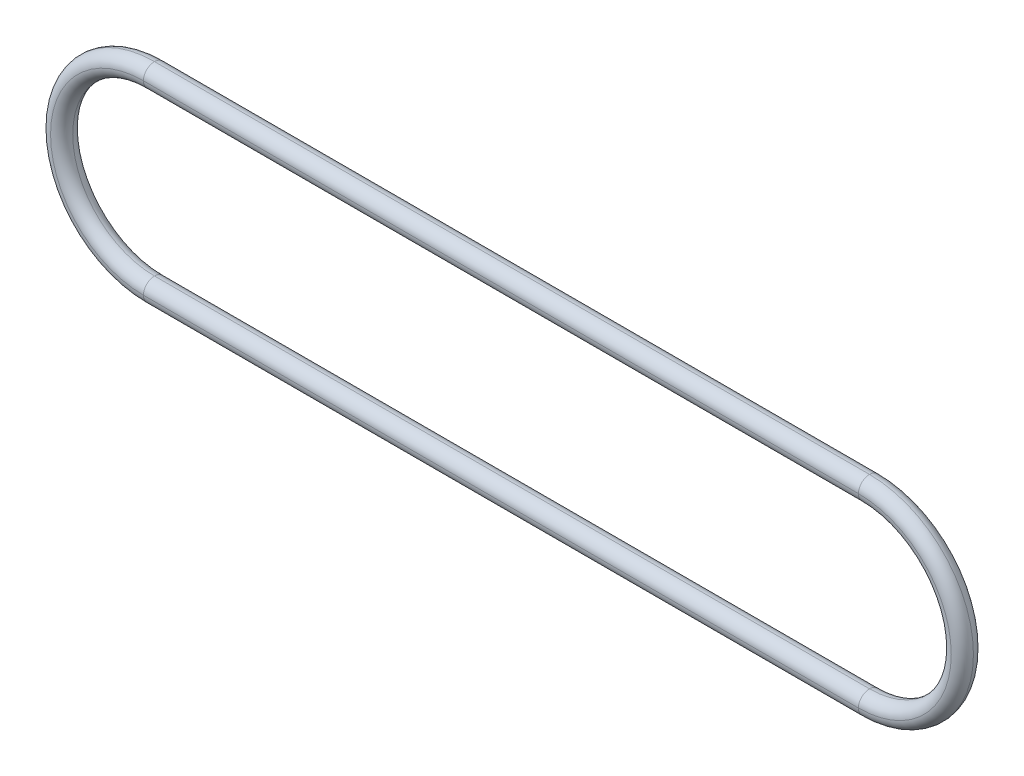
ISO-10303-21;
HEADER;
FILE_DESCRIPTION(('STEP AP214'),'2;1');
FILE_NAME('part.step','',(''),(''),'','','');
FILE_SCHEMA(('AUTOMOTIVE_DESIGN { 1 0 10303 214 1 1 1 1 }'));
ENDSEC;
DATA;
#1=APPLICATION_CONTEXT('core data for automotive mechanical design processes');
#2=APPLICATION_PROTOCOL_DEFINITION('international standard','automotive_design',2000,#1);
#3=PRODUCT_CONTEXT('',#1,'mechanical');
#4=PRODUCT('Part','Part','',(#3));
#5=PRODUCT_RELATED_PRODUCT_CATEGORY('part','',(#4));
#6=PRODUCT_DEFINITION_FORMATION('','',#4);
#7=PRODUCT_DEFINITION_CONTEXT('part definition',#1,'design');
#8=PRODUCT_DEFINITION('design','',#6,#7);
#9=PRODUCT_DEFINITION_SHAPE('','',#8);
#10=(LENGTH_UNIT() NAMED_UNIT(*) SI_UNIT(.MILLI.,.METRE.));
#11=(NAMED_UNIT(*) PLANE_ANGLE_UNIT() SI_UNIT($,.RADIAN.));
#12=(NAMED_UNIT(*) SI_UNIT($,.STERADIAN.) SOLID_ANGLE_UNIT());
#13=UNCERTAINTY_MEASURE_WITH_UNIT(LENGTH_MEASURE(1.E-05),#10,'distance_accuracy_value','');
#14=(GEOMETRIC_REPRESENTATION_CONTEXT(3) GLOBAL_UNCERTAINTY_ASSIGNED_CONTEXT((#13)) GLOBAL_UNIT_ASSIGNED_CONTEXT((#10,
#11,#12)) REPRESENTATION_CONTEXT('',''));
#15=CARTESIAN_POINT('',(0.,0.,0.));
#16=DIRECTION('',(0.,0.,1.));
#17=DIRECTION('',(1.,0.,0.));
#18=AXIS2_PLACEMENT_3D('',#15,#16,#17);
#19=CARTESIAN_POINT('',(0.,0.,2.));
#20=DIRECTION('',(0.,0.,1.));
#21=DIRECTION('',(1.,0.,0.));
#22=AXIS2_PLACEMENT_3D('',#19,#20,#21);
#23=TOROIDAL_SURFACE('',#22,16.75,2.);
#24=CARTESIAN_POINT('',(0.,-16.75,2.));
#25=DIRECTION('',(1.,0.,0.));
#26=DIRECTION('',(0.,0.,-1.));
#27=AXIS2_PLACEMENT_3D('',#24,#25,#26);
#28=CIRCLE('',#27,2.);
#29=CARTESIAN_POINT('',(0.,-16.75,4.));
#30=VERTEX_POINT('',#29);
#31=CARTESIAN_POINT('',(0.,-18.75,2.));
#32=VERTEX_POINT('',#31);
#33=EDGE_CURVE('E11',#30,#32,#28,.T.);
#34=ORIENTED_EDGE('',*,*,#33,.F.);
#35=CARTESIAN_POINT('',(0.,0.,4.));
#36=DIRECTION('',(0.,0.,1.));
#37=DIRECTION('',(1.,0.,0.));
#38=AXIS2_PLACEMENT_3D('',#35,#36,#37);
#39=CIRCLE('',#38,16.75);
#40=CARTESIAN_POINT('',(0.,16.75,4.));
#41=VERTEX_POINT('',#40);
#42=EDGE_CURVE('E190',#41,#30,#39,.T.);
#43=ORIENTED_EDGE('',*,*,#42,.F.);
#44=CARTESIAN_POINT('',(0.,16.75,2.));
#45=DIRECTION('',(1.,0.,0.));
#46=DIRECTION('',(0.,0.,-1.));
#47=AXIS2_PLACEMENT_3D('',#44,#45,#46);
#48=CIRCLE('',#47,2.);
#49=CARTESIAN_POINT('',(0.,18.75,2.));
#50=VERTEX_POINT('',#49);
#51=EDGE_CURVE('E187',#50,#41,#48,.T.);
#52=ORIENTED_EDGE('',*,*,#51,.F.);
#53=CARTESIAN_POINT('',(0.,0.,2.));
#54=DIRECTION('',(0.,0.,1.));
#55=DIRECTION('',(1.,0.,0.));
#56=AXIS2_PLACEMENT_3D('',#53,#54,#55);
#57=CIRCLE('',#56,18.75);
#58=EDGE_CURVE('E39',#32,#50,#57,.F.);
#59=ORIENTED_EDGE('',*,*,#58,.F.);
#60=EDGE_LOOP('',(#34,#43,#52,#59));
#61=FACE_BOUND('',#60,.T.);
#62=ADVANCED_FACE('F32',(#61),#23,.T.);
#63=CARTESIAN_POINT('',(0.,-16.75,2.));
#64=DIRECTION('',(-1.,0.,0.));
#65=DIRECTION('',(0.,0.,1.));
#66=AXIS2_PLACEMENT_3D('',#63,#64,#65);
#67=CYLINDRICAL_SURFACE('',#66,2.);
#68=DIRECTION('',(1.,0.,0.));
#69=VECTOR('',#68,1.);
#70=CARTESIAN_POINT('',(129.,-16.75,4.));
#71=LINE('',#70,#69);
#72=CARTESIAN_POINT('',(129.,-16.75,4.));
#73=VERTEX_POINT('',#72);
#74=EDGE_CURVE('E185',#30,#73,#71,.T.);
#75=ORIENTED_EDGE('',*,*,#74,.F.);
#76=ORIENTED_EDGE('',*,*,#33,.T.);
#77=DIRECTION('',(1.,0.,0.));
#78=VECTOR('',#77,1.);
#79=CARTESIAN_POINT('',(0.,-18.75,2.));
#80=LINE('',#79,#78);
#81=CARTESIAN_POINT('',(129.,-18.75,2.));
#82=VERTEX_POINT('',#81);
#83=EDGE_CURVE('E177',#82,#32,#80,.F.);
#84=ORIENTED_EDGE('',*,*,#83,.F.);
#85=CARTESIAN_POINT('',(129.,-16.75,2.));
#86=DIRECTION('',(1.,0.,0.));
#87=DIRECTION('',(0.,0.,-1.));
#88=AXIS2_PLACEMENT_3D('',#85,#86,#87);
#89=CIRCLE('',#88,2.);
#90=EDGE_CURVE('E174',#73,#82,#89,.T.);
#91=ORIENTED_EDGE('',*,*,#90,.F.);
#92=EDGE_LOOP('',(#75,#76,#84,#91));
#93=FACE_BOUND('',#92,.T.);
#94=ADVANCED_FACE('F222',(#93),#67,.T.);
#95=CARTESIAN_POINT('',(0.,0.,2.));
#96=DIRECTION('',(0.,0.,1.));
#97=DIRECTION('',(1.,0.,0.));
#98=AXIS2_PLACEMENT_3D('',#95,#96,#97);
#99=TOROIDAL_SURFACE('',#98,16.75,2.);
#100=CARTESIAN_POINT('',(0.,-16.75,2.));
#101=DIRECTION('',(1.,0.,0.));
#102=DIRECTION('',(0.,0.,-1.));
#103=AXIS2_PLACEMENT_3D('',#100,#101,#102);
#104=CIRCLE('',#103,2.);
#105=CARTESIAN_POINT('',(0.,-16.75,0.));
#106=VERTEX_POINT('',#105);
#107=EDGE_CURVE('E180',#32,#106,#104,.T.);
#108=ORIENTED_EDGE('',*,*,#107,.F.);
#109=ORIENTED_EDGE('',*,*,#58,.T.);
#110=CARTESIAN_POINT('',(0.,16.75,2.));
#111=DIRECTION('',(1.,0.,0.));
#112=DIRECTION('',(0.,0.,-1.));
#113=AXIS2_PLACEMENT_3D('',#110,#111,#112);
#114=CIRCLE('',#113,2.);
#115=CARTESIAN_POINT('',(0.,16.75,0.));
#116=VERTEX_POINT('',#115);
#117=EDGE_CURVE('E169',#116,#50,#114,.T.);
#118=ORIENTED_EDGE('',*,*,#117,.F.);
#119=CARTESIAN_POINT('',(0.,0.,0.));
#120=DIRECTION('',(0.,0.,1.));
#121=DIRECTION('',(1.,0.,0.));
#122=AXIS2_PLACEMENT_3D('',#119,#120,#121);
#123=CIRCLE('',#122,16.75);
#124=EDGE_CURVE('E166',#106,#116,#123,.F.);
#125=ORIENTED_EDGE('',*,*,#124,.F.);
#126=EDGE_LOOP('',(#108,#109,#118,#125));
#127=FACE_BOUND('',#126,.T.);
#128=ADVANCED_FACE('F194',(#127),#99,.T.);
#129=CARTESIAN_POINT('',(0.,0.,2.));
#130=DIRECTION('',(0.,0.,1.));
#131=DIRECTION('',(1.,0.,0.));
#132=AXIS2_PLACEMENT_3D('',#129,#130,#131);
#133=TOROIDAL_SURFACE('',#132,16.75,2.);
#134=CARTESIAN_POINT('',(0.,16.75,2.));
#135=DIRECTION('',(1.,0.,0.));
#136=DIRECTION('',(0.,0.,-1.));
#137=AXIS2_PLACEMENT_3D('',#134,#135,#136);
#138=CIRCLE('',#137,2.);
#139=CARTESIAN_POINT('',(0.,14.75,2.));
#140=VERTEX_POINT('',#139);
#141=EDGE_CURVE('E160',#41,#140,#138,.T.);
#142=ORIENTED_EDGE('',*,*,#141,.F.);
#143=ORIENTED_EDGE('',*,*,#42,.T.);
#144=CARTESIAN_POINT('',(0.,-16.75,2.));
#145=DIRECTION('',(1.,0.,0.));
#146=DIRECTION('',(0.,0.,-1.));
#147=AXIS2_PLACEMENT_3D('',#144,#145,#146);
#148=CIRCLE('',#147,2.);
#149=CARTESIAN_POINT('',(0.,-14.75,2.));
#150=VERTEX_POINT('',#149);
#151=EDGE_CURVE('E182',#150,#30,#148,.T.);
#152=ORIENTED_EDGE('',*,*,#151,.F.);
#153=CARTESIAN_POINT('',(0.,0.,2.));
#154=DIRECTION('',(0.,0.,1.));
#155=DIRECTION('',(1.,0.,0.));
#156=AXIS2_PLACEMENT_3D('',#153,#154,#155);
#157=CIRCLE('',#156,14.75);
#158=EDGE_CURVE('E163',#140,#150,#157,.T.);
#159=ORIENTED_EDGE('',*,*,#158,.F.);
#160=EDGE_LOOP('',(#142,#143,#152,#159));
#161=FACE_BOUND('',#160,.T.);
#162=ADVANCED_FACE('F220',(#161),#133,.T.);
#163=CARTESIAN_POINT('',(0.,16.75,2.));
#164=DIRECTION('',(1.,0.,0.));
#165=DIRECTION('',(0.,0.,-1.));
#166=AXIS2_PLACEMENT_3D('',#163,#164,#165);
#167=CYLINDRICAL_SURFACE('',#166,2.);
#168=DIRECTION('',(-1.,0.,0.));
#169=VECTOR('',#168,1.);
#170=CARTESIAN_POINT('',(129.,18.75,2.));
#171=LINE('',#170,#169);
#172=CARTESIAN_POINT('',(129.,18.75,2.));
#173=VERTEX_POINT('',#172);
#174=EDGE_CURVE('E100',#50,#173,#171,.F.);
#175=ORIENTED_EDGE('',*,*,#174,.F.);
#176=ORIENTED_EDGE('',*,*,#51,.T.);
#177=DIRECTION('',(-1.,0.,0.));
#178=VECTOR('',#177,1.);
#179=CARTESIAN_POINT('',(0.,16.75,4.));
#180=LINE('',#179,#178);
#181=CARTESIAN_POINT('',(129.,16.75,4.));
#182=VERTEX_POINT('',#181);
#183=EDGE_CURVE('E157',#182,#41,#180,.T.);
#184=ORIENTED_EDGE('',*,*,#183,.F.);
#185=CARTESIAN_POINT('',(129.,16.75,2.));
#186=DIRECTION('',(1.,0.,0.));
#187=DIRECTION('',(0.,0.,-1.));
#188=AXIS2_PLACEMENT_3D('',#185,#186,#187);
#189=CIRCLE('',#188,2.);
#190=EDGE_CURVE('E172',#173,#182,#189,.T.);
#191=ORIENTED_EDGE('',*,*,#190,.F.);
#192=EDGE_LOOP('',(#175,#176,#184,#191));
#193=FACE_BOUND('',#192,.T.);
#194=ADVANCED_FACE('F199',(#193),#167,.T.);
#195=CARTESIAN_POINT('',(0.,-16.75,2.));
#196=DIRECTION('',(1.,0.,0.));
#197=DIRECTION('',(0.,0.,-1.));
#198=AXIS2_PLACEMENT_3D('',#195,#196,#197);
#199=CYLINDRICAL_SURFACE('',#198,2.);
#200=ORIENTED_EDGE('',*,*,#151,.T.);
#201=ORIENTED_EDGE('',*,*,#74,.T.);
#202=CARTESIAN_POINT('',(129.,-16.75,2.));
#203=DIRECTION('',(1.,0.,0.));
#204=DIRECTION('',(0.,0.,-1.));
#205=AXIS2_PLACEMENT_3D('',#202,#203,#204);
#206=CIRCLE('',#205,2.);
#207=CARTESIAN_POINT('',(129.,-14.75,2.));
#208=VERTEX_POINT('',#207);
#209=EDGE_CURVE('E149',#208,#73,#206,.T.);
#210=ORIENTED_EDGE('',*,*,#209,.F.);
#211=DIRECTION('',(1.,0.,0.));
#212=VECTOR('',#211,1.);
#213=CARTESIAN_POINT('',(0.,-14.75,2.));
#214=LINE('',#213,#212);
#215=EDGE_CURVE('E146',#150,#208,#214,.T.);
#216=ORIENTED_EDGE('',*,*,#215,.F.);
#217=EDGE_LOOP('',(#200,#201,#210,#216));
#218=FACE_BOUND('',#217,.T.);
#219=ADVANCED_FACE('F221',(#218),#199,.T.);
#220=CARTESIAN_POINT('',(0.,-16.75,2.));
#221=DIRECTION('',(1.,0.,0.));
#222=DIRECTION('',(0.,0.,-1.));
#223=AXIS2_PLACEMENT_3D('',#220,#221,#222);
#224=CYLINDRICAL_SURFACE('',#223,2.);
#225=ORIENTED_EDGE('',*,*,#83,.T.);
#226=ORIENTED_EDGE('',*,*,#107,.T.);
#227=DIRECTION('',(1.,0.,0.));
#228=VECTOR('',#227,1.);
#229=CARTESIAN_POINT('',(0.,-16.75,0.));
#230=LINE('',#229,#228);
#231=CARTESIAN_POINT('',(129.,-16.75,0.));
#232=VERTEX_POINT('',#231);
#233=EDGE_CURVE('E140',#232,#106,#230,.F.);
#234=ORIENTED_EDGE('',*,*,#233,.F.);
#235=CARTESIAN_POINT('',(129.,-16.75,2.));
#236=DIRECTION('',(1.,0.,0.));
#237=DIRECTION('',(0.,0.,-1.));
#238=AXIS2_PLACEMENT_3D('',#235,#236,#237);
#239=CIRCLE('',#238,2.);
#240=EDGE_CURVE('E121',#82,#232,#239,.T.);
#241=ORIENTED_EDGE('',*,*,#240,.F.);
#242=EDGE_LOOP('',(#225,#226,#234,#241));
#243=FACE_BOUND('',#242,.T.);
#244=ADVANCED_FACE('F206',(#243),#224,.T.);
#245=CARTESIAN_POINT('',(129.,0.,2.));
#246=DIRECTION('',(0.,0.,1.));
#247=DIRECTION('',(1.,0.,0.));
#248=AXIS2_PLACEMENT_3D('',#245,#246,#247);
#249=TOROIDAL_SURFACE('',#248,16.75,2.);
#250=CARTESIAN_POINT('',(129.,0.,4.));
#251=DIRECTION('',(0.,0.,1.));
#252=DIRECTION('',(1.,0.,0.));
#253=AXIS2_PLACEMENT_3D('',#250,#251,#252);
#254=CIRCLE('',#253,16.75);
#255=EDGE_CURVE('E152',#73,#182,#254,.T.);
#256=ORIENTED_EDGE('',*,*,#255,.F.);
#257=ORIENTED_EDGE('',*,*,#90,.T.);
#258=CARTESIAN_POINT('',(129.,0.,2.));
#259=DIRECTION('',(0.,0.,1.));
#260=DIRECTION('',(1.,0.,0.));
#261=AXIS2_PLACEMENT_3D('',#258,#259,#260);
#262=CIRCLE('',#261,18.75);
#263=EDGE_CURVE('E105',#173,#82,#262,.F.);
#264=ORIENTED_EDGE('',*,*,#263,.F.);
#265=ORIENTED_EDGE('',*,*,#190,.T.);
#266=EDGE_LOOP('',(#256,#257,#264,#265));
#267=FACE_BOUND('',#266,.T.);
#268=ADVANCED_FACE('F203',(#267),#249,.T.);
#269=CARTESIAN_POINT('',(0.,16.75,2.));
#270=DIRECTION('',(-1.,0.,0.));
#271=DIRECTION('',(0.,0.,1.));
#272=AXIS2_PLACEMENT_3D('',#269,#270,#271);
#273=CYLINDRICAL_SURFACE('',#272,2.);
#274=ORIENTED_EDGE('',*,*,#117,.T.);
#275=ORIENTED_EDGE('',*,*,#174,.T.);
#276=CARTESIAN_POINT('',(129.,16.75,2.));
#277=DIRECTION('',(1.,0.,0.));
#278=DIRECTION('',(0.,0.,-1.));
#279=AXIS2_PLACEMENT_3D('',#276,#277,#278);
#280=CIRCLE('',#279,2.);
#281=CARTESIAN_POINT('',(129.,16.75,0.));
#282=VERTEX_POINT('',#281);
#283=EDGE_CURVE('E93',#282,#173,#280,.T.);
#284=ORIENTED_EDGE('',*,*,#283,.F.);
#285=DIRECTION('',(-1.,0.,0.));
#286=VECTOR('',#285,1.);
#287=CARTESIAN_POINT('',(0.,16.75,0.));
#288=LINE('',#287,#286);
#289=EDGE_CURVE('E97',#116,#282,#288,.F.);
#290=ORIENTED_EDGE('',*,*,#289,.F.);
#291=EDGE_LOOP('',(#274,#275,#284,#290));
#292=FACE_BOUND('',#291,.T.);
#293=ADVANCED_FACE('F96',(#292),#273,.T.);
#294=CARTESIAN_POINT('',(0.,0.,2.));
#295=DIRECTION('',(0.,0.,1.));
#296=DIRECTION('',(1.,0.,0.));
#297=AXIS2_PLACEMENT_3D('',#294,#295,#296);
#298=TOROIDAL_SURFACE('',#297,16.75,2.);
#299=CARTESIAN_POINT('',(0.,16.75,2.));
#300=DIRECTION('',(1.,0.,0.));
#301=DIRECTION('',(0.,0.,-1.));
#302=AXIS2_PLACEMENT_3D('',#299,#300,#301);
#303=CIRCLE('',#302,2.);
#304=EDGE_CURVE('E114',#140,#116,#303,.T.);
#305=ORIENTED_EDGE('',*,*,#304,.F.);
#306=ORIENTED_EDGE('',*,*,#158,.T.);
#307=CARTESIAN_POINT('',(0.,-16.75,2.));
#308=DIRECTION('',(1.,0.,0.));
#309=DIRECTION('',(0.,0.,-1.));
#310=AXIS2_PLACEMENT_3D('',#307,#308,#309);
#311=CIRCLE('',#310,2.);
#312=EDGE_CURVE('E143',#106,#150,#311,.T.);
#313=ORIENTED_EDGE('',*,*,#312,.F.);
#314=ORIENTED_EDGE('',*,*,#124,.T.);
#315=EDGE_LOOP('',(#305,#306,#313,#314));
#316=FACE_BOUND('',#315,.T.);
#317=ADVANCED_FACE('F219',(#316),#298,.T.);
#318=CARTESIAN_POINT('',(0.,16.75,2.));
#319=DIRECTION('',(-1.,0.,0.));
#320=DIRECTION('',(0.,0.,1.));
#321=AXIS2_PLACEMENT_3D('',#318,#319,#320);
#322=CYLINDRICAL_SURFACE('',#321,2.);
#323=CARTESIAN_POINT('',(129.,16.75,2.));
#324=DIRECTION('',(1.,0.,0.));
#325=DIRECTION('',(0.,0.,-1.));
#326=AXIS2_PLACEMENT_3D('',#323,#324,#325);
#327=CIRCLE('',#326,2.);
#328=CARTESIAN_POINT('',(129.,14.75,2.));
#329=VERTEX_POINT('',#328);
#330=EDGE_CURVE('E155',#182,#329,#327,.T.);
#331=ORIENTED_EDGE('',*,*,#330,.F.);
#332=ORIENTED_EDGE('',*,*,#183,.T.);
#333=ORIENTED_EDGE('',*,*,#141,.T.);
#334=DIRECTION('',(-1.,0.,0.));
#335=VECTOR('',#334,1.);
#336=CARTESIAN_POINT('',(0.,14.75,2.));
#337=LINE('',#336,#335);
#338=EDGE_CURVE('E135',#329,#140,#337,.T.);
#339=ORIENTED_EDGE('',*,*,#338,.F.);
#340=EDGE_LOOP('',(#331,#332,#333,#339));
#341=FACE_BOUND('',#340,.T.);
#342=ADVANCED_FACE('F216',(#341),#322,.T.);
#343=CARTESIAN_POINT('',(129.,0.,2.));
#344=DIRECTION('',(0.,0.,1.));
#345=DIRECTION('',(1.,0.,0.));
#346=AXIS2_PLACEMENT_3D('',#343,#344,#345);
#347=TOROIDAL_SURFACE('',#346,16.75,2.);
#348=ORIENTED_EDGE('',*,*,#255,.T.);
#349=ORIENTED_EDGE('',*,*,#330,.T.);
#350=CARTESIAN_POINT('',(129.,0.,2.));
#351=DIRECTION('',(0.,0.,1.));
#352=DIRECTION('',(1.,0.,0.));
#353=AXIS2_PLACEMENT_3D('',#350,#351,#352);
#354=CIRCLE('',#353,14.75);
#355=EDGE_CURVE('E130',#208,#329,#354,.T.);
#356=ORIENTED_EDGE('',*,*,#355,.F.);
#357=ORIENTED_EDGE('',*,*,#209,.T.);
#358=EDGE_LOOP('',(#348,#349,#356,#357));
#359=FACE_BOUND('',#358,.T.);
#360=ADVANCED_FACE('F213',(#359),#347,.T.);
#361=CARTESIAN_POINT('',(0.,-16.75,2.));
#362=DIRECTION('',(-1.,0.,0.));
#363=DIRECTION('',(0.,0.,1.));
#364=AXIS2_PLACEMENT_3D('',#361,#362,#363);
#365=CYLINDRICAL_SURFACE('',#364,2.);
#366=ORIENTED_EDGE('',*,*,#312,.T.);
#367=ORIENTED_EDGE('',*,*,#215,.T.);
#368=CARTESIAN_POINT('',(129.,-16.75,2.));
#369=DIRECTION('',(1.,0.,0.));
#370=DIRECTION('',(0.,0.,-1.));
#371=AXIS2_PLACEMENT_3D('',#368,#369,#370);
#372=CIRCLE('',#371,2.);
#373=EDGE_CURVE('E125',#232,#208,#372,.T.);
#374=ORIENTED_EDGE('',*,*,#373,.F.);
#375=ORIENTED_EDGE('',*,*,#233,.T.);
#376=EDGE_LOOP('',(#366,#367,#374,#375));
#377=FACE_BOUND('',#376,.T.);
#378=ADVANCED_FACE('F208',(#377),#365,.T.);
#379=CARTESIAN_POINT('',(129.,0.,2.));
#380=DIRECTION('',(0.,0.,1.));
#381=DIRECTION('',(1.,0.,0.));
#382=AXIS2_PLACEMENT_3D('',#379,#380,#381);
#383=TOROIDAL_SURFACE('',#382,16.75,2.);
#384=ORIENTED_EDGE('',*,*,#263,.T.);
#385=ORIENTED_EDGE('',*,*,#240,.T.);
#386=CARTESIAN_POINT('',(129.,0.,0.));
#387=DIRECTION('',(0.,0.,1.));
#388=DIRECTION('',(1.,0.,0.));
#389=AXIS2_PLACEMENT_3D('',#386,#387,#388);
#390=CIRCLE('',#389,16.75);
#391=EDGE_CURVE('E118',#282,#232,#390,.F.);
#392=ORIENTED_EDGE('',*,*,#391,.F.);
#393=ORIENTED_EDGE('',*,*,#283,.T.);
#394=EDGE_LOOP('',(#384,#385,#392,#393));
#395=FACE_BOUND('',#394,.T.);
#396=ADVANCED_FACE('F119',(#395),#383,.T.);
#397=CARTESIAN_POINT('',(0.,16.75,2.));
#398=DIRECTION('',(1.,0.,0.));
#399=DIRECTION('',(0.,0.,-1.));
#400=AXIS2_PLACEMENT_3D('',#397,#398,#399);
#401=CYLINDRICAL_SURFACE('',#400,2.);
#402=ORIENTED_EDGE('',*,*,#304,.T.);
#403=ORIENTED_EDGE('',*,*,#289,.T.);
#404=CARTESIAN_POINT('',(129.,16.75,2.));
#405=DIRECTION('',(1.,0.,0.));
#406=DIRECTION('',(0.,0.,-1.));
#407=AXIS2_PLACEMENT_3D('',#404,#405,#406);
#408=CIRCLE('',#407,2.);
#409=EDGE_CURVE('E112',#329,#282,#408,.T.);
#410=ORIENTED_EDGE('',*,*,#409,.F.);
#411=ORIENTED_EDGE('',*,*,#338,.T.);
#412=EDGE_LOOP('',(#402,#403,#410,#411));
#413=FACE_BOUND('',#412,.T.);
#414=ADVANCED_FACE('F109',(#413),#401,.T.);
#415=CARTESIAN_POINT('',(129.,0.,2.));
#416=DIRECTION('',(0.,0.,1.));
#417=DIRECTION('',(1.,0.,0.));
#418=AXIS2_PLACEMENT_3D('',#415,#416,#417);
#419=TOROIDAL_SURFACE('',#418,16.75,2.);
#420=ORIENTED_EDGE('',*,*,#373,.T.);
#421=ORIENTED_EDGE('',*,*,#355,.T.);
#422=ORIENTED_EDGE('',*,*,#409,.T.);
#423=ORIENTED_EDGE('',*,*,#391,.T.);
#424=EDGE_LOOP('',(#420,#421,#422,#423));
#425=FACE_BOUND('',#424,.T.);
#426=ADVANCED_FACE('F128',(#425),#419,.T.);
#427=CLOSED_SHELL('',(#62,#94,#128,#162,#194,#219,#244,#268,#293,#317,#342,#360,#378,#396,#414,#426));
#428=MANIFOLD_SOLID_BREP('B2',#427);
#429=ADVANCED_BREP_SHAPE_REPRESENTATION('',(#18,#428),#14);
#430=SHAPE_DEFINITION_REPRESENTATION(#9,#429);
ENDSEC;
END-ISO-10303-21;
